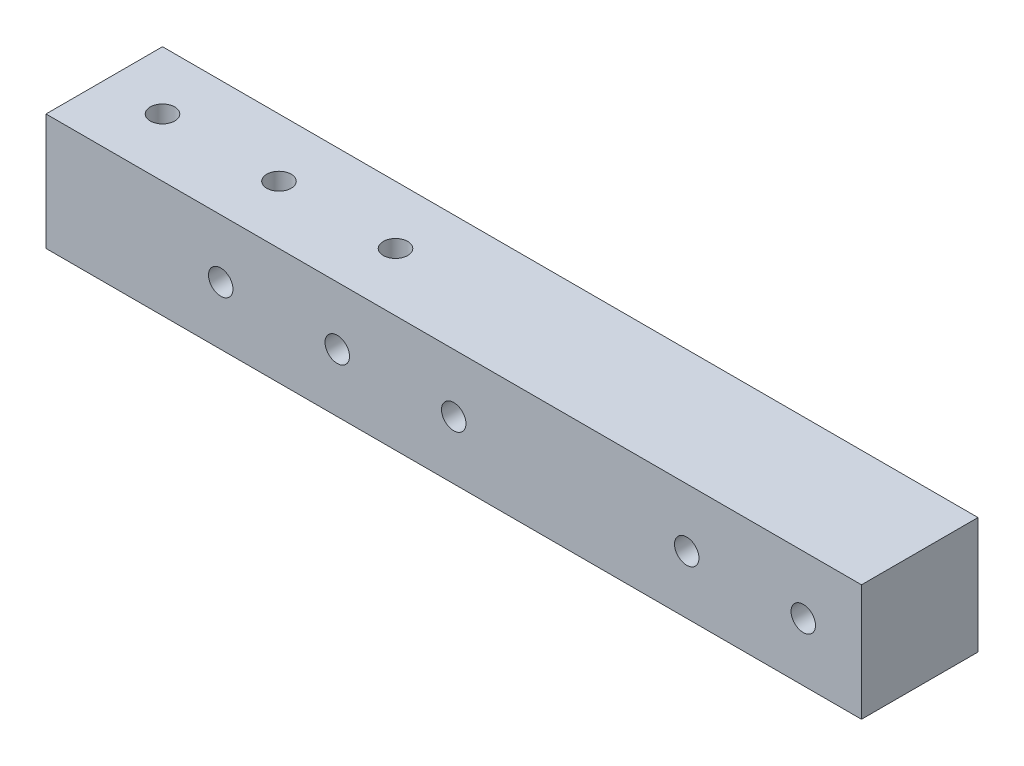
ISO-10303-21;
HEADER;
FILE_DESCRIPTION(('STEP AP214'),'2;1');
FILE_NAME('part.step','',(''),(''),'','','');
FILE_SCHEMA(('AUTOMOTIVE_DESIGN { 1 0 10303 214 1 1 1 1 }'));
ENDSEC;
DATA;
#1=APPLICATION_CONTEXT('core data for automotive mechanical design processes');
#2=APPLICATION_PROTOCOL_DEFINITION('international standard','automotive_design',2000,#1);
#3=PRODUCT_CONTEXT('',#1,'mechanical');
#4=PRODUCT('Part','Part','',(#3));
#5=PRODUCT_RELATED_PRODUCT_CATEGORY('part','',(#4));
#6=PRODUCT_DEFINITION_FORMATION('','',#4);
#7=PRODUCT_DEFINITION_CONTEXT('part definition',#1,'design');
#8=PRODUCT_DEFINITION('design','',#6,#7);
#9=PRODUCT_DEFINITION_SHAPE('','',#8);
#10=(LENGTH_UNIT() NAMED_UNIT(*) SI_UNIT(.MILLI.,.METRE.));
#11=(NAMED_UNIT(*) PLANE_ANGLE_UNIT() SI_UNIT($,.RADIAN.));
#12=(NAMED_UNIT(*) SI_UNIT($,.STERADIAN.) SOLID_ANGLE_UNIT());
#13=UNCERTAINTY_MEASURE_WITH_UNIT(LENGTH_MEASURE(1.E-05),#10,'distance_accuracy_value','');
#14=(GEOMETRIC_REPRESENTATION_CONTEXT(3) GLOBAL_UNCERTAINTY_ASSIGNED_CONTEXT((#13)) GLOBAL_UNIT_ASSIGNED_CONTEXT((#10,
#11,#12)) REPRESENTATION_CONTEXT('',''));
#15=CARTESIAN_POINT('',(0.,0.,0.));
#16=DIRECTION('',(0.,0.,1.));
#17=DIRECTION('',(1.,0.,0.));
#18=AXIS2_PLACEMENT_3D('',#15,#16,#17);
#19=CARTESIAN_POINT('',(50.,0.,-10.));
#20=DIRECTION('',(0.,0.,1.));
#21=DIRECTION('',(1.,0.,0.));
#22=AXIS2_PLACEMENT_3D('',#19,#20,#21);
#23=CYLINDRICAL_SURFACE('',#22,2.09999999999999);
#24=CARTESIAN_POINT('',(50.,0.,10.));
#25=DIRECTION('',(0.,0.,1.));
#26=DIRECTION('',(1.,0.,0.));
#27=AXIS2_PLACEMENT_3D('',#24,#25,#26);
#28=CIRCLE('',#27,2.09999999999999);
#29=CARTESIAN_POINT('',(52.1,0.,10.));
#30=VERTEX_POINT('',#29);
#31=EDGE_CURVE('E221',#30,#30,#28,.T.);
#32=ORIENTED_EDGE('',*,*,#31,.T.);
#33=EDGE_LOOP('',(#32));
#34=FACE_BOUND('',#33,.T.);
#35=CARTESIAN_POINT('',(50.,0.,0.));
#36=DIRECTION('',(0.,-0.707106781186547,0.707106781186547));
#37=DIRECTION('',(0.,0.707106781186547,0.707106781186547));
#38=AXIS2_PLACEMENT_3D('',#35,#36,#37);
#39=ELLIPSE('',#38,2.96984848098349,2.09999999999999);
#40=CARTESIAN_POINT('',(47.9,0.,0.));
#41=VERTEX_POINT('',#40);
#42=CARTESIAN_POINT('',(52.1,0.,0.));
#43=VERTEX_POINT('',#42);
#44=EDGE_CURVE('E53',#41,#43,#39,.F.);
#45=ORIENTED_EDGE('',*,*,#44,.T.);
#46=CARTESIAN_POINT('',(50.,0.,0.));
#47=DIRECTION('',(0.,0.707106781186547,0.707106781186547));
#48=DIRECTION('',(0.,-0.707106781186547,0.707106781186547));
#49=AXIS2_PLACEMENT_3D('',#46,#47,#48);
#50=ELLIPSE('',#49,2.96984848098349,2.09999999999999);
#51=EDGE_CURVE('E11',#43,#41,#50,.F.);
#52=ORIENTED_EDGE('',*,*,#51,.T.);
#53=EDGE_LOOP('',(#45,#52));
#54=FACE_BOUND('',#53,.T.);
#55=ADVANCED_FACE('F39',(#34,#54),#23,.F.);
#56=CARTESIAN_POINT('',(30.,0.,-10.));
#57=DIRECTION('',(0.,0.,1.));
#58=DIRECTION('',(1.,0.,0.));
#59=AXIS2_PLACEMENT_3D('',#56,#57,#58);
#60=CYLINDRICAL_SURFACE('',#59,2.1);
#61=CARTESIAN_POINT('',(30.,0.,10.));
#62=DIRECTION('',(0.,0.,1.));
#63=DIRECTION('',(1.,0.,0.));
#64=AXIS2_PLACEMENT_3D('',#61,#62,#63);
#65=CIRCLE('',#64,2.1);
#66=CARTESIAN_POINT('',(32.1,0.,10.));
#67=VERTEX_POINT('',#66);
#68=EDGE_CURVE('E212',#67,#67,#65,.T.);
#69=ORIENTED_EDGE('',*,*,#68,.T.);
#70=EDGE_LOOP('',(#69));
#71=FACE_BOUND('',#70,.T.);
#72=CARTESIAN_POINT('',(30.,0.,0.));
#73=DIRECTION('',(0.,-0.707106781186547,0.707106781186547));
#74=DIRECTION('',(0.,0.707106781186547,0.707106781186547));
#75=AXIS2_PLACEMENT_3D('',#72,#73,#74);
#76=ELLIPSE('',#75,2.9698484809835,2.1);
#77=CARTESIAN_POINT('',(27.9,0.,0.));
#78=VERTEX_POINT('',#77);
#79=CARTESIAN_POINT('',(32.1,0.,0.));
#80=VERTEX_POINT('',#79);
#81=EDGE_CURVE('E60',#78,#80,#76,.F.);
#82=ORIENTED_EDGE('',*,*,#81,.T.);
#83=CARTESIAN_POINT('',(30.,0.,0.));
#84=DIRECTION('',(0.,0.707106781186547,0.707106781186547));
#85=DIRECTION('',(0.,-0.707106781186547,0.707106781186547));
#86=AXIS2_PLACEMENT_3D('',#83,#84,#85);
#87=ELLIPSE('',#86,2.9698484809835,2.1);
#88=EDGE_CURVE('E96',#80,#78,#87,.F.);
#89=ORIENTED_EDGE('',*,*,#88,.T.);
#90=EDGE_LOOP('',(#82,#89));
#91=FACE_BOUND('',#90,.T.);
#92=ADVANCED_FACE('F107',(#71,#91),#60,.F.);
#93=CARTESIAN_POINT('',(140.,10.,-10.));
#94=DIRECTION('',(0.,0.,1.));
#95=DIRECTION('',(1.,0.,0.));
#96=AXIS2_PLACEMENT_3D('',#93,#94,#95);
#97=PLANE('',#96);
#98=CARTESIAN_POINT('',(30.,0.,-10.));
#99=DIRECTION('',(0.,0.,1.));
#100=DIRECTION('',(1.,0.,0.));
#101=AXIS2_PLACEMENT_3D('',#98,#99,#100);
#102=CIRCLE('',#101,2.1);
#103=CARTESIAN_POINT('',(32.1,0.,-10.));
#104=VERTEX_POINT('',#103);
#105=EDGE_CURVE('E207',#104,#104,#102,.T.);
#106=ORIENTED_EDGE('',*,*,#105,.T.);
#107=EDGE_LOOP('',(#106));
#108=FACE_BOUND('',#107,.T.);
#109=CARTESIAN_POINT('',(110.,0.,-10.));
#110=DIRECTION('',(0.,0.,1.));
#111=DIRECTION('',(1.,0.,0.));
#112=AXIS2_PLACEMENT_3D('',#109,#110,#111);
#113=CIRCLE('',#112,2.1);
#114=CARTESIAN_POINT('',(112.1,0.,-10.));
#115=VERTEX_POINT('',#114);
#116=EDGE_CURVE('E226',#115,#115,#113,.T.);
#117=ORIENTED_EDGE('',*,*,#116,.T.);
#118=EDGE_LOOP('',(#117));
#119=FACE_BOUND('',#118,.T.);
#120=CARTESIAN_POINT('',(70.,0.,-10.));
#121=DIRECTION('',(0.,0.,1.));
#122=DIRECTION('',(1.,0.,0.));
#123=AXIS2_PLACEMENT_3D('',#120,#121,#122);
#124=CIRCLE('',#123,2.09999999999999);
#125=CARTESIAN_POINT('',(72.1,0.,-10.));
#126=VERTEX_POINT('',#125);
#127=EDGE_CURVE('E217',#126,#126,#124,.T.);
#128=ORIENTED_EDGE('',*,*,#127,.T.);
#129=EDGE_LOOP('',(#128));
#130=FACE_BOUND('',#129,.T.);
#131=CARTESIAN_POINT('',(50.,0.,-10.));
#132=DIRECTION('',(0.,0.,1.));
#133=DIRECTION('',(1.,0.,0.));
#134=AXIS2_PLACEMENT_3D('',#131,#132,#133);
#135=CIRCLE('',#134,2.09999999999999);
#136=CARTESIAN_POINT('',(52.1,0.,-10.));
#137=VERTEX_POINT('',#136);
#138=EDGE_CURVE('E240',#137,#137,#135,.T.);
#139=ORIENTED_EDGE('',*,*,#138,.T.);
#140=EDGE_LOOP('',(#139));
#141=FACE_BOUND('',#140,.T.);
#142=CARTESIAN_POINT('',(130.,0.,-10.));
#143=DIRECTION('',(0.,0.,1.));
#144=DIRECTION('',(1.,0.,0.));
#145=AXIS2_PLACEMENT_3D('',#142,#143,#144);
#146=CIRCLE('',#145,2.09999999999999);
#147=CARTESIAN_POINT('',(132.1,0.,-10.));
#148=VERTEX_POINT('',#147);
#149=EDGE_CURVE('E216',#148,#148,#146,.T.);
#150=ORIENTED_EDGE('',*,*,#149,.T.);
#151=EDGE_LOOP('',(#150));
#152=FACE_BOUND('',#151,.T.);
#153=DIRECTION('',(0.,1.,0.));
#154=VECTOR('',#153,1.);
#155=CARTESIAN_POINT('',(0.,10.,-10.));
#156=LINE('',#155,#154);
#157=CARTESIAN_POINT('',(0.,-10.,-10.));
#158=VERTEX_POINT('',#157);
#159=CARTESIAN_POINT('',(0.,10.,-10.));
#160=VERTEX_POINT('',#159);
#161=EDGE_CURVE('E211',#158,#160,#156,.T.);
#162=ORIENTED_EDGE('',*,*,#161,.T.);
#163=DIRECTION('',(-1.,0.,0.));
#164=VECTOR('',#163,1.);
#165=CARTESIAN_POINT('',(140.,10.,-10.));
#166=LINE('',#165,#164);
#167=CARTESIAN_POINT('',(140.,10.,-10.));
#168=VERTEX_POINT('',#167);
#169=EDGE_CURVE('E105',#168,#160,#166,.T.);
#170=ORIENTED_EDGE('',*,*,#169,.F.);
#171=DIRECTION('',(0.,1.,0.));
#172=VECTOR('',#171,1.);
#173=CARTESIAN_POINT('',(140.,10.,-10.));
#174=LINE('',#173,#172);
#175=CARTESIAN_POINT('',(140.,-10.,-10.));
#176=VERTEX_POINT('',#175);
#177=EDGE_CURVE('E246',#176,#168,#174,.T.);
#178=ORIENTED_EDGE('',*,*,#177,.F.);
#179=DIRECTION('',(-1.,0.,0.));
#180=VECTOR('',#179,1.);
#181=CARTESIAN_POINT('',(140.,-10.,-10.));
#182=LINE('',#181,#180);
#183=EDGE_CURVE('E260',#176,#158,#182,.T.);
#184=ORIENTED_EDGE('',*,*,#183,.T.);
#185=EDGE_LOOP('',(#162,#170,#178,#184));
#186=FACE_BOUND('',#185,.T.);
#187=ADVANCED_FACE('F41',(#108,#119,#130,#141,#152,#186),#97,.F.);
#188=CARTESIAN_POINT('',(140.,10.,10.));
#189=DIRECTION('',(0.,-1.,0.));
#190=DIRECTION('',(0.,0.,-1.));
#191=AXIS2_PLACEMENT_3D('',#188,#189,#190);
#192=PLANE('',#191);
#193=CARTESIAN_POINT('',(10.,10.,0.));
#194=DIRECTION('',(0.,1.,0.));
#195=DIRECTION('',(0.,0.,1.));
#196=AXIS2_PLACEMENT_3D('',#193,#194,#195);
#197=CIRCLE('',#196,2.1);
#198=CARTESIAN_POINT('',(10.,10.,2.1));
#199=VERTEX_POINT('',#198);
#200=EDGE_CURVE('E183',#199,#199,#197,.T.);
#201=ORIENTED_EDGE('',*,*,#200,.F.);
#202=EDGE_LOOP('',(#201));
#203=FACE_BOUND('',#202,.T.);
#204=CARTESIAN_POINT('',(30.,10.,0.));
#205=DIRECTION('',(0.,1.,0.));
#206=DIRECTION('',(0.,0.,1.));
#207=AXIS2_PLACEMENT_3D('',#204,#205,#206);
#208=CIRCLE('',#207,2.1);
#209=CARTESIAN_POINT('',(30.,10.,2.1));
#210=VERTEX_POINT('',#209);
#211=EDGE_CURVE('E193',#210,#210,#208,.T.);
#212=ORIENTED_EDGE('',*,*,#211,.F.);
#213=EDGE_LOOP('',(#212));
#214=FACE_BOUND('',#213,.T.);
#215=CARTESIAN_POINT('',(50.,10.,0.));
#216=DIRECTION('',(0.,1.,0.));
#217=DIRECTION('',(0.,0.,1.));
#218=AXIS2_PLACEMENT_3D('',#215,#216,#217);
#219=CIRCLE('',#218,2.1);
#220=CARTESIAN_POINT('',(50.,10.,2.1));
#221=VERTEX_POINT('',#220);
#222=EDGE_CURVE('E203',#221,#221,#219,.T.);
#223=ORIENTED_EDGE('',*,*,#222,.F.);
#224=EDGE_LOOP('',(#223));
#225=FACE_BOUND('',#224,.T.);
#226=DIRECTION('',(0.,0.,1.));
#227=VECTOR('',#226,1.);
#228=CARTESIAN_POINT('',(0.,10.,10.));
#229=LINE('',#228,#227);
#230=CARTESIAN_POINT('',(0.,10.,10.));
#231=VERTEX_POINT('',#230);
#232=EDGE_CURVE('E264',#160,#231,#229,.T.);
#233=ORIENTED_EDGE('',*,*,#232,.T.);
#234=DIRECTION('',(-1.,0.,0.));
#235=VECTOR('',#234,1.);
#236=CARTESIAN_POINT('',(140.,10.,10.));
#237=LINE('',#236,#235);
#238=CARTESIAN_POINT('',(140.,10.,10.));
#239=VERTEX_POINT('',#238);
#240=EDGE_CURVE('E279',#239,#231,#237,.T.);
#241=ORIENTED_EDGE('',*,*,#240,.F.);
#242=DIRECTION('',(0.,0.,1.));
#243=VECTOR('',#242,1.);
#244=CARTESIAN_POINT('',(140.,10.,10.));
#245=LINE('',#244,#243);
#246=EDGE_CURVE('E250',#168,#239,#245,.T.);
#247=ORIENTED_EDGE('',*,*,#246,.F.);
#248=ORIENTED_EDGE('',*,*,#169,.T.);
#249=EDGE_LOOP('',(#233,#241,#247,#248));
#250=FACE_BOUND('',#249,.T.);
#251=ADVANCED_FACE('F287',(#203,#214,#225,#250),#192,.F.);
#252=CARTESIAN_POINT('',(140.,10.,10.));
#253=DIRECTION('',(0.,0.,-1.));
#254=DIRECTION('',(0.,1.,0.));
#255=AXIS2_PLACEMENT_3D('',#252,#253,#254);
#256=PLANE('',#255);
#257=ORIENTED_EDGE('',*,*,#68,.F.);
#258=EDGE_LOOP('',(#257));
#259=FACE_BOUND('',#258,.T.);
#260=CARTESIAN_POINT('',(110.,0.,10.));
#261=DIRECTION('',(0.,0.,1.));
#262=DIRECTION('',(1.,0.,0.));
#263=AXIS2_PLACEMENT_3D('',#260,#261,#262);
#264=CIRCLE('',#263,2.1);
#265=CARTESIAN_POINT('',(112.1,0.,10.));
#266=VERTEX_POINT('',#265);
#267=EDGE_CURVE('E190',#266,#266,#264,.T.);
#268=ORIENTED_EDGE('',*,*,#267,.F.);
#269=EDGE_LOOP('',(#268));
#270=FACE_BOUND('',#269,.T.);
#271=CARTESIAN_POINT('',(70.,0.,10.));
#272=DIRECTION('',(0.,0.,1.));
#273=DIRECTION('',(1.,0.,0.));
#274=AXIS2_PLACEMENT_3D('',#271,#272,#273);
#275=CIRCLE('',#274,2.09999999999999);
#276=CARTESIAN_POINT('',(72.1,0.,10.));
#277=VERTEX_POINT('',#276);
#278=EDGE_CURVE('E222',#277,#277,#275,.T.);
#279=ORIENTED_EDGE('',*,*,#278,.F.);
#280=EDGE_LOOP('',(#279));
#281=FACE_BOUND('',#280,.T.);
#282=ORIENTED_EDGE('',*,*,#31,.F.);
#283=EDGE_LOOP('',(#282));
#284=FACE_BOUND('',#283,.T.);
#285=CARTESIAN_POINT('',(130.,0.,10.));
#286=DIRECTION('',(0.,0.,1.));
#287=DIRECTION('',(1.,0.,0.));
#288=AXIS2_PLACEMENT_3D('',#285,#286,#287);
#289=CIRCLE('',#288,2.09999999999999);
#290=CARTESIAN_POINT('',(132.1,0.,10.));
#291=VERTEX_POINT('',#290);
#292=EDGE_CURVE('E236',#291,#291,#289,.T.);
#293=ORIENTED_EDGE('',*,*,#292,.F.);
#294=EDGE_LOOP('',(#293));
#295=FACE_BOUND('',#294,.T.);
#296=DIRECTION('',(0.,-1.,0.));
#297=VECTOR('',#296,1.);
#298=CARTESIAN_POINT('',(0.,10.,10.));
#299=LINE('',#298,#297);
#300=CARTESIAN_POINT('',(0.,-10.,10.));
#301=VERTEX_POINT('',#300);
#302=EDGE_CURVE('E267',#231,#301,#299,.T.);
#303=ORIENTED_EDGE('',*,*,#302,.T.);
#304=DIRECTION('',(-1.,0.,0.));
#305=VECTOR('',#304,1.);
#306=CARTESIAN_POINT('',(140.,-10.,10.));
#307=LINE('',#306,#305);
#308=CARTESIAN_POINT('',(140.,-10.,10.));
#309=VERTEX_POINT('',#308);
#310=EDGE_CURVE('E275',#309,#301,#307,.T.);
#311=ORIENTED_EDGE('',*,*,#310,.F.);
#312=DIRECTION('',(0.,-1.,0.));
#313=VECTOR('',#312,1.);
#314=CARTESIAN_POINT('',(140.,10.,10.));
#315=LINE('',#314,#313);
#316=EDGE_CURVE('E254',#239,#309,#315,.T.);
#317=ORIENTED_EDGE('',*,*,#316,.F.);
#318=ORIENTED_EDGE('',*,*,#240,.T.);
#319=EDGE_LOOP('',(#303,#311,#317,#318));
#320=FACE_BOUND('',#319,.T.);
#321=ADVANCED_FACE('F297',(#259,#270,#281,#284,#295,#320),#256,.F.);
#322=CARTESIAN_POINT('',(140.,-10.,10.));
#323=DIRECTION('',(0.,1.,0.));
#324=DIRECTION('',(0.,0.,1.));
#325=AXIS2_PLACEMENT_3D('',#322,#323,#324);
#326=PLANE('',#325);
#327=CARTESIAN_POINT('',(10.,-10.,0.));
#328=DIRECTION('',(0.,1.,0.));
#329=DIRECTION('',(0.,0.,1.));
#330=AXIS2_PLACEMENT_3D('',#327,#328,#329);
#331=CIRCLE('',#330,2.1);
#332=CARTESIAN_POINT('',(10.,-10.,2.1));
#333=VERTEX_POINT('',#332);
#334=EDGE_CURVE('E180',#333,#333,#331,.T.);
#335=ORIENTED_EDGE('',*,*,#334,.T.);
#336=EDGE_LOOP('',(#335));
#337=FACE_BOUND('',#336,.T.);
#338=CARTESIAN_POINT('',(30.,-10.,0.));
#339=DIRECTION('',(0.,1.,0.));
#340=DIRECTION('',(0.,0.,1.));
#341=AXIS2_PLACEMENT_3D('',#338,#339,#340);
#342=CIRCLE('',#341,2.1);
#343=CARTESIAN_POINT('',(30.,-10.,2.1));
#344=VERTEX_POINT('',#343);
#345=EDGE_CURVE('E186',#344,#344,#342,.T.);
#346=ORIENTED_EDGE('',*,*,#345,.T.);
#347=EDGE_LOOP('',(#346));
#348=FACE_BOUND('',#347,.T.);
#349=CARTESIAN_POINT('',(50.,-10.,0.));
#350=DIRECTION('',(0.,1.,0.));
#351=DIRECTION('',(0.,0.,1.));
#352=AXIS2_PLACEMENT_3D('',#349,#350,#351);
#353=CIRCLE('',#352,2.1);
#354=CARTESIAN_POINT('',(50.,-10.,2.1));
#355=VERTEX_POINT('',#354);
#356=EDGE_CURVE('E199',#355,#355,#353,.T.);
#357=ORIENTED_EDGE('',*,*,#356,.T.);
#358=EDGE_LOOP('',(#357));
#359=FACE_BOUND('',#358,.T.);
#360=DIRECTION('',(0.,0.,-1.));
#361=VECTOR('',#360,1.);
#362=CARTESIAN_POINT('',(0.,-10.,10.));
#363=LINE('',#362,#361);
#364=EDGE_CURVE('E251',#301,#158,#363,.T.);
#365=ORIENTED_EDGE('',*,*,#364,.T.);
#366=ORIENTED_EDGE('',*,*,#183,.F.);
#367=DIRECTION('',(0.,0.,-1.));
#368=VECTOR('',#367,1.);
#369=CARTESIAN_POINT('',(140.,-10.,10.));
#370=LINE('',#369,#368);
#371=EDGE_CURVE('E257',#309,#176,#370,.T.);
#372=ORIENTED_EDGE('',*,*,#371,.F.);
#373=ORIENTED_EDGE('',*,*,#310,.T.);
#374=EDGE_LOOP('',(#365,#366,#372,#373));
#375=FACE_BOUND('',#374,.T.);
#376=ADVANCED_FACE('F301',(#337,#348,#359,#375),#326,.F.);
#377=CARTESIAN_POINT('',(140.,0.,0.));
#378=DIRECTION('',(1.,0.,0.));
#379=DIRECTION('',(0.,0.,-1.));
#380=AXIS2_PLACEMENT_3D('',#377,#378,#379);
#381=PLANE('',#380);
#382=ORIENTED_EDGE('',*,*,#177,.T.);
#383=ORIENTED_EDGE('',*,*,#246,.T.);
#384=ORIENTED_EDGE('',*,*,#316,.T.);
#385=ORIENTED_EDGE('',*,*,#371,.T.);
#386=EDGE_LOOP('',(#382,#383,#384,#385));
#387=FACE_BOUND('',#386,.T.);
#388=ADVANCED_FACE('F156',(#387),#381,.T.);
#389=CARTESIAN_POINT('',(0.,0.,0.));
#390=DIRECTION('',(1.,0.,0.));
#391=DIRECTION('',(0.,0.,-1.));
#392=AXIS2_PLACEMENT_3D('',#389,#390,#391);
#393=PLANE('',#392);
#394=ORIENTED_EDGE('',*,*,#161,.F.);
#395=ORIENTED_EDGE('',*,*,#364,.F.);
#396=ORIENTED_EDGE('',*,*,#302,.F.);
#397=ORIENTED_EDGE('',*,*,#232,.F.);
#398=EDGE_LOOP('',(#394,#395,#396,#397));
#399=FACE_BOUND('',#398,.T.);
#400=ADVANCED_FACE('F151',(#399),#393,.F.);
#401=CARTESIAN_POINT('',(130.,0.,-10.));
#402=DIRECTION('',(0.,0.,1.));
#403=DIRECTION('',(1.,0.,0.));
#404=AXIS2_PLACEMENT_3D('',#401,#402,#403);
#405=CYLINDRICAL_SURFACE('',#404,2.09999999999999);
#406=ORIENTED_EDGE('',*,*,#149,.F.);
#407=EDGE_LOOP('',(#406));
#408=FACE_BOUND('',#407,.T.);
#409=ORIENTED_EDGE('',*,*,#292,.T.);
#410=EDGE_LOOP('',(#409));
#411=FACE_BOUND('',#410,.T.);
#412=ADVANCED_FACE('F143',(#408,#411),#405,.F.);
#413=CARTESIAN_POINT('',(50.,0.,0.));
#414=DIRECTION('',(0.,-0.707106781186547,0.707106781186547));
#415=DIRECTION('',(0.,0.707106781186547,0.707106781186547));
#416=AXIS2_PLACEMENT_3D('',#413,#414,#415);
#417=ELLIPSE('',#416,2.96984848098349,2.09999999999999);
#418=EDGE_CURVE('E117',#41,#43,#417,.T.);
#419=ORIENTED_EDGE('',*,*,#418,.T.);
#420=CARTESIAN_POINT('',(50.,0.,0.));
#421=DIRECTION('',(0.,0.707106781186547,0.707106781186547));
#422=DIRECTION('',(0.,-0.707106781186547,0.707106781186547));
#423=AXIS2_PLACEMENT_3D('',#420,#421,#422);
#424=ELLIPSE('',#423,2.96984848098349,2.09999999999999);
#425=EDGE_CURVE('E48',#43,#41,#424,.T.);
#426=ORIENTED_EDGE('',*,*,#425,.T.);
#427=EDGE_LOOP('',(#419,#426));
#428=FACE_BOUND('',#427,.T.);
#429=ORIENTED_EDGE('',*,*,#138,.F.);
#430=EDGE_LOOP('',(#429));
#431=FACE_BOUND('',#430,.T.);
#432=ADVANCED_FACE('F123',(#428,#431),#23,.F.);
#433=CARTESIAN_POINT('',(70.,0.,-10.));
#434=DIRECTION('',(0.,0.,1.));
#435=DIRECTION('',(1.,0.,0.));
#436=AXIS2_PLACEMENT_3D('',#433,#434,#435);
#437=CYLINDRICAL_SURFACE('',#436,2.09999999999999);
#438=ORIENTED_EDGE('',*,*,#127,.F.);
#439=EDGE_LOOP('',(#438));
#440=FACE_BOUND('',#439,.T.);
#441=ORIENTED_EDGE('',*,*,#278,.T.);
#442=EDGE_LOOP('',(#441));
#443=FACE_BOUND('',#442,.T.);
#444=ADVANCED_FACE('F142',(#440,#443),#437,.F.);
#445=CARTESIAN_POINT('',(110.,0.,-10.));
#446=DIRECTION('',(0.,0.,1.));
#447=DIRECTION('',(1.,0.,0.));
#448=AXIS2_PLACEMENT_3D('',#445,#446,#447);
#449=CYLINDRICAL_SURFACE('',#448,2.1);
#450=ORIENTED_EDGE('',*,*,#116,.F.);
#451=EDGE_LOOP('',(#450));
#452=FACE_BOUND('',#451,.T.);
#453=ORIENTED_EDGE('',*,*,#267,.T.);
#454=EDGE_LOOP('',(#453));
#455=FACE_BOUND('',#454,.T.);
#456=ADVANCED_FACE('F148',(#452,#455),#449,.F.);
#457=CARTESIAN_POINT('',(30.,0.,0.));
#458=DIRECTION('',(0.,-0.707106781186547,0.707106781186547));
#459=DIRECTION('',(0.,0.707106781186547,0.707106781186547));
#460=AXIS2_PLACEMENT_3D('',#457,#458,#459);
#461=ELLIPSE('',#460,2.9698484809835,2.1);
#462=EDGE_CURVE('E94',#78,#80,#461,.T.);
#463=ORIENTED_EDGE('',*,*,#462,.T.);
#464=CARTESIAN_POINT('',(30.,0.,0.));
#465=DIRECTION('',(0.,0.707106781186547,0.707106781186547));
#466=DIRECTION('',(0.,-0.707106781186547,0.707106781186547));
#467=AXIS2_PLACEMENT_3D('',#464,#465,#466);
#468=ELLIPSE('',#467,2.9698484809835,2.1);
#469=EDGE_CURVE('E100',#80,#78,#468,.T.);
#470=ORIENTED_EDGE('',*,*,#469,.T.);
#471=EDGE_LOOP('',(#463,#470));
#472=FACE_BOUND('',#471,.T.);
#473=ORIENTED_EDGE('',*,*,#105,.F.);
#474=EDGE_LOOP('',(#473));
#475=FACE_BOUND('',#474,.T.);
#476=ADVANCED_FACE('F110',(#472,#475),#60,.F.);
#477=CARTESIAN_POINT('',(30.,-10.,0.));
#478=DIRECTION('',(0.,1.,0.));
#479=DIRECTION('',(0.,0.,1.));
#480=AXIS2_PLACEMENT_3D('',#477,#478,#479);
#481=CYLINDRICAL_SURFACE('',#480,2.1);
#482=ORIENTED_EDGE('',*,*,#211,.T.);
#483=EDGE_LOOP('',(#482));
#484=FACE_BOUND('',#483,.T.);
#485=ORIENTED_EDGE('',*,*,#81,.F.);
#486=ORIENTED_EDGE('',*,*,#469,.F.);
#487=EDGE_LOOP('',(#485,#486));
#488=FACE_BOUND('',#487,.T.);
#489=ADVANCED_FACE('F103',(#484,#488),#481,.F.);
#490=ORIENTED_EDGE('',*,*,#345,.F.);
#491=EDGE_LOOP('',(#490));
#492=FACE_BOUND('',#491,.T.);
#493=ORIENTED_EDGE('',*,*,#462,.F.);
#494=ORIENTED_EDGE('',*,*,#88,.F.);
#495=EDGE_LOOP('',(#493,#494));
#496=FACE_BOUND('',#495,.T.);
#497=ADVANCED_FACE('F95',(#492,#496),#481,.F.);
#498=CARTESIAN_POINT('',(50.,-10.,0.));
#499=DIRECTION('',(0.,1.,0.));
#500=DIRECTION('',(0.,0.,1.));
#501=AXIS2_PLACEMENT_3D('',#498,#499,#500);
#502=CYLINDRICAL_SURFACE('',#501,2.1);
#503=ORIENTED_EDGE('',*,*,#222,.T.);
#504=EDGE_LOOP('',(#503));
#505=FACE_BOUND('',#504,.T.);
#506=ORIENTED_EDGE('',*,*,#44,.F.);
#507=ORIENTED_EDGE('',*,*,#425,.F.);
#508=EDGE_LOOP('',(#506,#507));
#509=FACE_BOUND('',#508,.T.);
#510=ADVANCED_FACE('F127',(#505,#509),#502,.F.);
#511=ORIENTED_EDGE('',*,*,#356,.F.);
#512=EDGE_LOOP('',(#511));
#513=FACE_BOUND('',#512,.T.);
#514=ORIENTED_EDGE('',*,*,#418,.F.);
#515=ORIENTED_EDGE('',*,*,#51,.F.);
#516=EDGE_LOOP('',(#514,#515));
#517=FACE_BOUND('',#516,.T.);
#518=ADVANCED_FACE('F129',(#513,#517),#502,.F.);
#519=CARTESIAN_POINT('',(10.,-10.,0.));
#520=DIRECTION('',(0.,1.,0.));
#521=DIRECTION('',(0.,0.,1.));
#522=AXIS2_PLACEMENT_3D('',#519,#520,#521);
#523=CYLINDRICAL_SURFACE('',#522,2.1);
#524=ORIENTED_EDGE('',*,*,#334,.F.);
#525=EDGE_LOOP('',(#524));
#526=FACE_BOUND('',#525,.T.);
#527=ORIENTED_EDGE('',*,*,#200,.T.);
#528=EDGE_LOOP('',(#527));
#529=FACE_BOUND('',#528,.T.);
#530=ADVANCED_FACE('F168',(#526,#529),#523,.F.);
#531=CLOSED_SHELL('',(#55,#92,#187,#251,#321,#376,#388,#400,#412,#432,#444,#456,#476,#489,#497,
#510,#518,#530));
#532=MANIFOLD_SOLID_BREP('B2',#531);
#533=ADVANCED_BREP_SHAPE_REPRESENTATION('',(#18,#532),#14);
#534=SHAPE_DEFINITION_REPRESENTATION(#9,#533);
ENDSEC;
END-ISO-10303-21;
